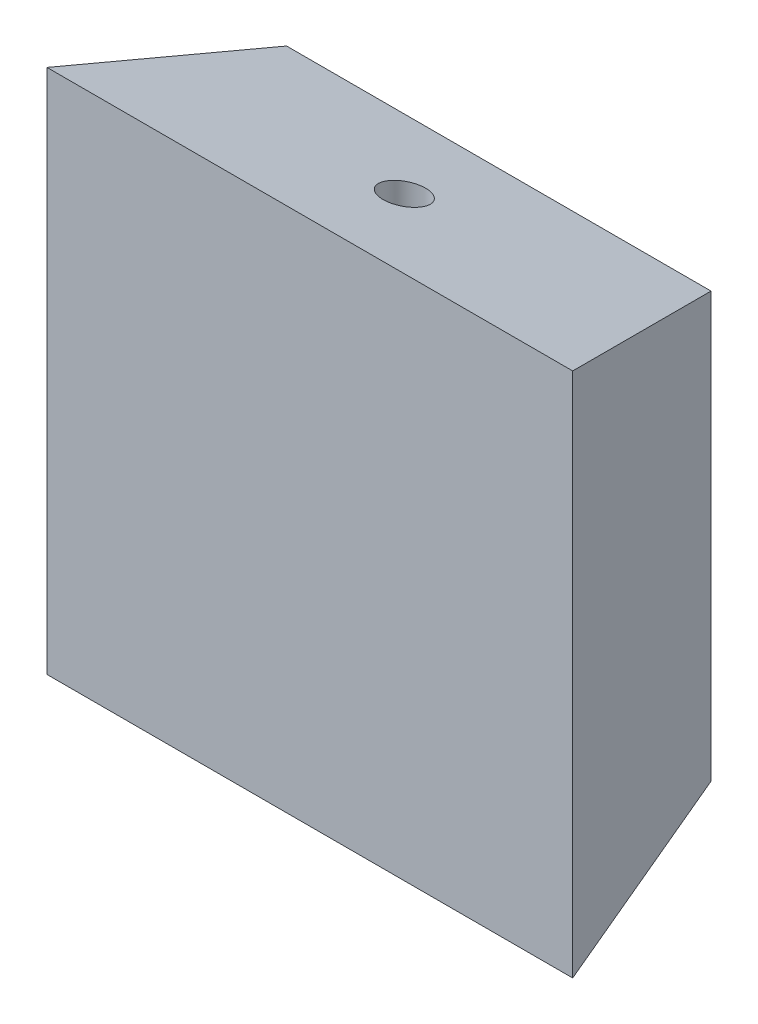
ISO-10303-21;
HEADER;
FILE_DESCRIPTION(('STEP AP214'),'2;1');
FILE_NAME('part.step','',(''),(''),'','','');
FILE_SCHEMA(('AUTOMOTIVE_DESIGN { 1 0 10303 214 1 1 1 1 }'));
ENDSEC;
DATA;
#1=APPLICATION_CONTEXT('core data for automotive mechanical design processes');
#2=APPLICATION_PROTOCOL_DEFINITION('international standard','automotive_design',2000,#1);
#3=PRODUCT_CONTEXT('',#1,'mechanical');
#4=PRODUCT('Part','Part','',(#3));
#5=PRODUCT_RELATED_PRODUCT_CATEGORY('part','',(#4));
#6=PRODUCT_DEFINITION_FORMATION('','',#4);
#7=PRODUCT_DEFINITION_CONTEXT('part definition',#1,'design');
#8=PRODUCT_DEFINITION('design','',#6,#7);
#9=PRODUCT_DEFINITION_SHAPE('','',#8);
#10=(LENGTH_UNIT() NAMED_UNIT(*) SI_UNIT(.MILLI.,.METRE.));
#11=(NAMED_UNIT(*) PLANE_ANGLE_UNIT() SI_UNIT($,.RADIAN.));
#12=(NAMED_UNIT(*) SI_UNIT($,.STERADIAN.) SOLID_ANGLE_UNIT());
#13=UNCERTAINTY_MEASURE_WITH_UNIT(LENGTH_MEASURE(1.E-05),#10,'distance_accuracy_value','');
#14=(GEOMETRIC_REPRESENTATION_CONTEXT(3) GLOBAL_UNCERTAINTY_ASSIGNED_CONTEXT((#13)) GLOBAL_UNIT_ASSIGNED_CONTEXT((#10,
#11,#12)) REPRESENTATION_CONTEXT('',''));
#15=CARTESIAN_POINT('',(0.,0.,0.));
#16=DIRECTION('',(0.,0.,1.));
#17=DIRECTION('',(1.,0.,0.));
#18=AXIS2_PLACEMENT_3D('',#15,#16,#17);
#19=CARTESIAN_POINT('',(16.637,-16.637,0.));
#20=DIRECTION('',(0.965925826289068,0.,-0.258819045102521));
#21=DIRECTION('',(-0.258819045102521,0.,-0.965925826289068));
#22=AXIS2_PLACEMENT_3D('',#19,#20,#21);
#23=PLANE('',#22);
#24=DIRECTION('',(0.,1.,0.));
#25=VECTOR('',#24,1.);
#26=CARTESIAN_POINT('',(16.637,-16.637,0.));
#27=LINE('',#26,#25);
#28=CARTESIAN_POINT('',(16.637,-16.637,0.));
#29=VERTEX_POINT('',#28);
#30=CARTESIAN_POINT('',(16.637,16.637,0.));
#31=VERTEX_POINT('',#30);
#32=EDGE_CURVE('E80',#29,#31,#27,.T.);
#33=ORIENTED_EDGE('',*,*,#32,.T.);
#34=DIRECTION('',(-0.250562807085732,-0.250562807085732,-0.935113126531029));
#35=VECTOR('',#34,1.);
#36=CARTESIAN_POINT('',(14.5480010389148,14.5480010389148,-7.7962502597287));
#37=LINE('',#36,#35);
#38=CARTESIAN_POINT('',(20.6068870042049,20.6068870042049,14.81582));
#39=VERTEX_POINT('',#38);
#40=EDGE_CURVE('E11',#39,#31,#37,.T.);
#41=ORIENTED_EDGE('',*,*,#40,.F.);
#42=DIRECTION('',(0.,-1.,0.));
#43=VECTOR('',#42,1.);
#44=CARTESIAN_POINT('',(20.6068870042049,0.,14.81582));
#45=LINE('',#44,#43);
#46=CARTESIAN_POINT('',(20.6068870042049,-20.6068870042049,14.81582));
#47=VERTEX_POINT('',#46);
#48=EDGE_CURVE('E99',#47,#39,#45,.F.);
#49=ORIENTED_EDGE('',*,*,#48,.F.);
#50=DIRECTION('',(-0.250562807085732,0.250562807085732,-0.935113126531029));
#51=VECTOR('',#50,1.);
#52=CARTESIAN_POINT('',(16.637,-16.637,0.));
#53=LINE('',#52,#51);
#54=EDGE_CURVE('E91',#47,#29,#53,.T.);
#55=ORIENTED_EDGE('',*,*,#54,.T.);
#56=EDGE_LOOP('',(#33,#41,#49,#55));
#57=FACE_BOUND('',#56,.T.);
#58=ADVANCED_FACE('F33',(#57),#23,.T.);
#59=CARTESIAN_POINT('',(-16.637,16.637,0.));
#60=DIRECTION('',(0.,0.965925826289068,-0.258819045102521));
#61=DIRECTION('',(0.,0.258819045102521,0.965925826289068));
#62=AXIS2_PLACEMENT_3D('',#59,#60,#61);
#63=PLANE('',#62);
#64=CARTESIAN_POINT('',(0.,18.6219435021024,7.40791));
#65=DIRECTION('',(0.,0.965925826289068,-0.258819045102521));
#66=DIRECTION('',(0.,0.258819045102521,0.965925826289068));
#67=AXIS2_PLACEMENT_3D('',#64,#65,#66);
#68=ELLIPSE('',#67,1.72567598322106,1.666875);
#69=CARTESIAN_POINT('',(0.,19.0685813122361,9.074785));
#70=VERTEX_POINT('',#69);
#71=EDGE_CURVE('E37',#70,#70,#68,.F.);
#72=ORIENTED_EDGE('',*,*,#71,.T.);
#73=EDGE_LOOP('',(#72));
#74=FACE_BOUND('',#73,.T.);
#75=DIRECTION('',(-1.,0.,0.));
#76=VECTOR('',#75,1.);
#77=CARTESIAN_POINT('',(-16.637,16.637,0.));
#78=LINE('',#77,#76);
#79=CARTESIAN_POINT('',(-16.637,16.637,0.));
#80=VERTEX_POINT('',#79);
#81=EDGE_CURVE('E76',#31,#80,#78,.T.);
#82=ORIENTED_EDGE('',*,*,#81,.T.);
#83=DIRECTION('',(0.250562807085732,-0.250562807085732,-0.935113126531029));
#84=VECTOR('',#83,1.);
#85=CARTESIAN_POINT('',(-14.5480010389148,14.5480010389148,-7.7962502597287));
#86=LINE('',#85,#84);
#87=CARTESIAN_POINT('',(-20.6068870042049,20.6068870042049,14.81582));
#88=VERTEX_POINT('',#87);
#89=EDGE_CURVE('E42',#88,#80,#86,.T.);
#90=ORIENTED_EDGE('',*,*,#89,.F.);
#91=DIRECTION('',(1.,0.,0.));
#92=VECTOR('',#91,1.);
#93=CARTESIAN_POINT('',(0.,20.6068870042049,14.81582));
#94=LINE('',#93,#92);
#95=EDGE_CURVE('E87',#39,#88,#94,.F.);
#96=ORIENTED_EDGE('',*,*,#95,.F.);
#97=ORIENTED_EDGE('',*,*,#40,.T.);
#98=EDGE_LOOP('',(#82,#90,#96,#97));
#99=FACE_BOUND('',#98,.T.);
#100=ADVANCED_FACE('F35',(#74,#99),#63,.T.);
#101=CARTESIAN_POINT('',(-16.637,-16.637,0.));
#102=DIRECTION('',(-0.965925826289068,0.,-0.258819045102521));
#103=DIRECTION('',(-0.258819045102521,0.,0.965925826289068));
#104=AXIS2_PLACEMENT_3D('',#101,#102,#103);
#105=PLANE('',#104);
#106=DIRECTION('',(0.,-1.,0.));
#107=VECTOR('',#106,1.);
#108=CARTESIAN_POINT('',(-16.637,-16.637,0.));
#109=LINE('',#108,#107);
#110=CARTESIAN_POINT('',(-16.637,-16.637,0.));
#111=VERTEX_POINT('',#110);
#112=EDGE_CURVE('E81',#80,#111,#109,.T.);
#113=ORIENTED_EDGE('',*,*,#112,.T.);
#114=DIRECTION('',(0.250562807085732,0.250562807085732,-0.935113126531029));
#115=VECTOR('',#114,1.);
#116=CARTESIAN_POINT('',(-16.637,-16.637,0.));
#117=LINE('',#116,#115);
#118=CARTESIAN_POINT('',(-20.6068870042049,-20.6068870042049,14.81582));
#119=VERTEX_POINT('',#118);
#120=EDGE_CURVE('E102',#119,#111,#117,.T.);
#121=ORIENTED_EDGE('',*,*,#120,.F.);
#122=DIRECTION('',(0.,1.,0.));
#123=VECTOR('',#122,1.);
#124=CARTESIAN_POINT('',(-20.6068870042049,0.,14.81582));
#125=LINE('',#124,#123);
#126=EDGE_CURVE('E55',#88,#119,#125,.F.);
#127=ORIENTED_EDGE('',*,*,#126,.F.);
#128=ORIENTED_EDGE('',*,*,#89,.T.);
#129=EDGE_LOOP('',(#113,#121,#127,#128));
#130=FACE_BOUND('',#129,.T.);
#131=ADVANCED_FACE('F110',(#130),#105,.T.);
#132=CARTESIAN_POINT('',(-16.637,-16.637,0.));
#133=DIRECTION('',(0.,-0.965925826289068,-0.258819045102521));
#134=DIRECTION('',(0.,0.258819045102521,-0.965925826289068));
#135=AXIS2_PLACEMENT_3D('',#132,#133,#134);
#136=PLANE('',#135);
#137=DIRECTION('',(1.,0.,0.));
#138=VECTOR('',#137,1.);
#139=CARTESIAN_POINT('',(-16.637,-16.637,0.));
#140=LINE('',#139,#138);
#141=EDGE_CURVE('E98',#111,#29,#140,.T.);
#142=ORIENTED_EDGE('',*,*,#141,.T.);
#143=ORIENTED_EDGE('',*,*,#54,.F.);
#144=DIRECTION('',(-1.,0.,0.));
#145=VECTOR('',#144,1.);
#146=CARTESIAN_POINT('',(0.,-20.6068870042049,14.81582));
#147=LINE('',#146,#145);
#148=EDGE_CURVE('E50',#119,#47,#147,.F.);
#149=ORIENTED_EDGE('',*,*,#148,.F.);
#150=ORIENTED_EDGE('',*,*,#120,.T.);
#151=EDGE_LOOP('',(#142,#143,#149,#150));
#152=FACE_BOUND('',#151,.T.);
#153=ADVANCED_FACE('F112',(#152),#136,.T.);
#154=CARTESIAN_POINT('',(0.,0.,14.81582));
#155=DIRECTION('',(0.,0.,-1.));
#156=DIRECTION('',(-1.,0.,0.));
#157=AXIS2_PLACEMENT_3D('',#154,#155,#156);
#158=PLANE('',#157);
#159=ORIENTED_EDGE('',*,*,#48,.T.);
#160=ORIENTED_EDGE('',*,*,#95,.T.);
#161=ORIENTED_EDGE('',*,*,#126,.T.);
#162=ORIENTED_EDGE('',*,*,#148,.T.);
#163=EDGE_LOOP('',(#159,#160,#161,#162));
#164=FACE_BOUND('',#163,.T.);
#165=ADVANCED_FACE('F108',(#164),#158,.F.);
#166=CARTESIAN_POINT('',(0.,0.,0.));
#167=DIRECTION('',(0.,0.,-1.));
#168=DIRECTION('',(-1.,0.,0.));
#169=AXIS2_PLACEMENT_3D('',#166,#167,#168);
#170=PLANE('',#169);
#171=ORIENTED_EDGE('',*,*,#32,.F.);
#172=ORIENTED_EDGE('',*,*,#141,.F.);
#173=ORIENTED_EDGE('',*,*,#112,.F.);
#174=ORIENTED_EDGE('',*,*,#81,.F.);
#175=EDGE_LOOP('',(#171,#172,#173,#174));
#176=FACE_BOUND('',#175,.T.);
#177=ADVANCED_FACE('F77',(#176),#170,.T.);
#178=CARTESIAN_POINT('',(0.,7.62,7.40791));
#179=DIRECTION('',(0.,1.,0.));
#180=DIRECTION('',(0.,0.,1.));
#181=AXIS2_PLACEMENT_3D('',#178,#179,#180);
#182=CYLINDRICAL_SURFACE('',#181,1.666875);
#183=CARTESIAN_POINT('',(0.,7.62,7.40791));
#184=DIRECTION('',(0.,1.,0.));
#185=DIRECTION('',(0.,0.,1.));
#186=AXIS2_PLACEMENT_3D('',#183,#184,#185);
#187=CIRCLE('',#186,1.666875);
#188=CARTESIAN_POINT('',(0.,7.62,9.074785));
#189=VERTEX_POINT('',#188);
#190=EDGE_CURVE('E94',#189,#189,#187,.T.);
#191=ORIENTED_EDGE('',*,*,#190,.F.);
#192=EDGE_LOOP('',(#191));
#193=FACE_BOUND('',#192,.T.);
#194=ORIENTED_EDGE('',*,*,#71,.F.);
#195=EDGE_LOOP('',(#194));
#196=FACE_BOUND('',#195,.T.);
#197=ADVANCED_FACE('F128',(#193,#196),#182,.F.);
#198=CARTESIAN_POINT('',(0.,7.62,0.));
#199=DIRECTION('',(0.,1.,0.));
#200=DIRECTION('',(0.,0.,1.));
#201=AXIS2_PLACEMENT_3D('',#198,#199,#200);
#202=PLANE('',#201);
#203=ORIENTED_EDGE('',*,*,#190,.T.);
#204=EDGE_LOOP('',(#203));
#205=FACE_BOUND('',#204,.T.);
#206=ADVANCED_FACE('F132',(#205),#202,.T.);
#207=CLOSED_SHELL('',(#58,#100,#131,#153,#165,#177,#197,#206));
#208=MANIFOLD_SOLID_BREP('B2',#207);
#209=ADVANCED_BREP_SHAPE_REPRESENTATION('',(#18,#208),#14);
#210=SHAPE_DEFINITION_REPRESENTATION(#9,#209);
ENDSEC;
END-ISO-10303-21;
